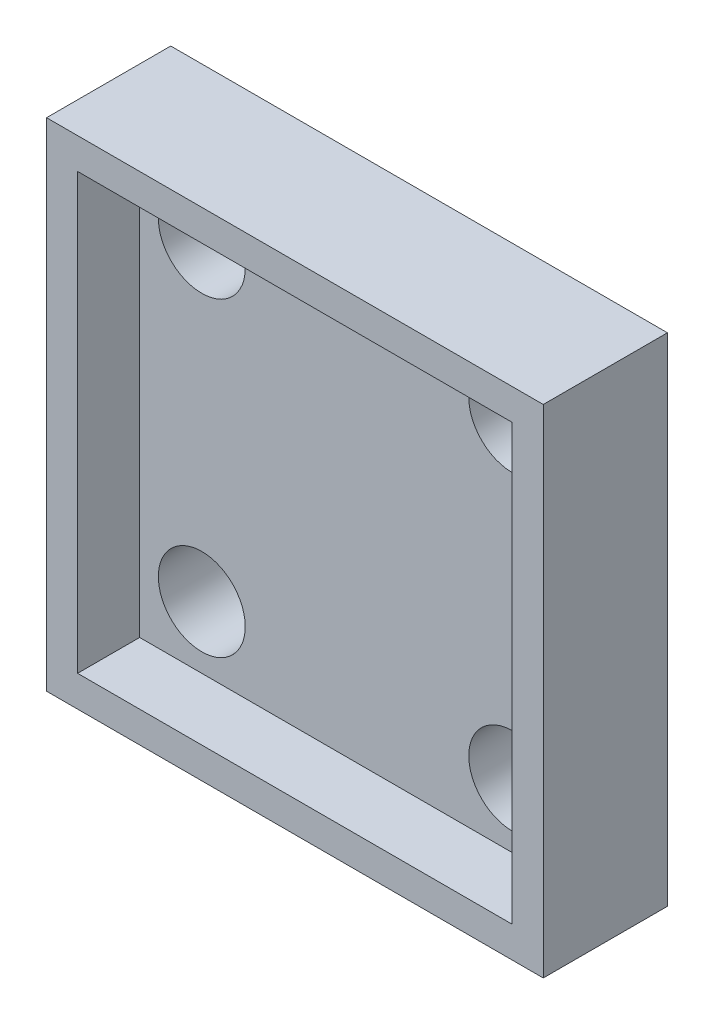
ISO-10303-21;
HEADER;
FILE_DESCRIPTION(('STEP AP214'),'2;1');
FILE_NAME('part.step','',(''),(''),'','','');
FILE_SCHEMA(('AUTOMOTIVE_DESIGN { 1 0 10303 214 1 1 1 1 }'));
ENDSEC;
DATA;
#1=APPLICATION_CONTEXT('core data for automotive mechanical design processes');
#2=APPLICATION_PROTOCOL_DEFINITION('international standard','automotive_design',2000,#1);
#3=PRODUCT_CONTEXT('',#1,'mechanical');
#4=PRODUCT('Part','Part','',(#3));
#5=PRODUCT_RELATED_PRODUCT_CATEGORY('part','',(#4));
#6=PRODUCT_DEFINITION_FORMATION('','',#4);
#7=PRODUCT_DEFINITION_CONTEXT('part definition',#1,'design');
#8=PRODUCT_DEFINITION('design','',#6,#7);
#9=PRODUCT_DEFINITION_SHAPE('','',#8);
#10=(LENGTH_UNIT() NAMED_UNIT(*) SI_UNIT(.MILLI.,.METRE.));
#11=(NAMED_UNIT(*) PLANE_ANGLE_UNIT() SI_UNIT($,.RADIAN.));
#12=(NAMED_UNIT(*) SI_UNIT($,.STERADIAN.) SOLID_ANGLE_UNIT());
#13=UNCERTAINTY_MEASURE_WITH_UNIT(LENGTH_MEASURE(1.E-05),#10,'distance_accuracy_value','');
#14=(GEOMETRIC_REPRESENTATION_CONTEXT(3) GLOBAL_UNCERTAINTY_ASSIGNED_CONTEXT((#13)) GLOBAL_UNIT_ASSIGNED_CONTEXT((#10,
#11,#12)) REPRESENTATION_CONTEXT('',''));
#15=CARTESIAN_POINT('',(0.,0.,0.));
#16=DIRECTION('',(0.,0.,1.));
#17=DIRECTION('',(1.,0.,0.));
#18=AXIS2_PLACEMENT_3D('',#15,#16,#17);
#19=CARTESIAN_POINT('',(-20.,-20.,5.00000000000004));
#20=DIRECTION('',(1.,0.,0.));
#21=DIRECTION('',(0.,0.,-1.));
#22=AXIS2_PLACEMENT_3D('',#19,#20,#21);
#23=PLANE('',#22);
#24=DIRECTION('',(0.,-1.,0.));
#25=VECTOR('',#24,1.);
#26=CARTESIAN_POINT('',(-20.,-20.,0.));
#27=LINE('',#26,#25);
#28=CARTESIAN_POINT('',(-20.,20.,0.));
#29=VERTEX_POINT('',#28);
#30=CARTESIAN_POINT('',(-20.,-20.,0.));
#31=VERTEX_POINT('',#30);
#32=EDGE_CURVE('E169',#29,#31,#27,.T.);
#33=ORIENTED_EDGE('',*,*,#32,.T.);
#34=DIRECTION('',(0.,0.,-1.));
#35=VECTOR('',#34,1.);
#36=CARTESIAN_POINT('',(-20.,-20.,5.00000000000004));
#37=LINE('',#36,#35);
#38=CARTESIAN_POINT('',(-20.,-20.,10.0000000000001));
#39=VERTEX_POINT('',#38);
#40=EDGE_CURVE('E11',#39,#31,#37,.T.);
#41=ORIENTED_EDGE('',*,*,#40,.F.);
#42=DIRECTION('',(0.,-1.,0.));
#43=VECTOR('',#42,1.);
#44=CARTESIAN_POINT('',(-20.,-20.,10.0000000000001));
#45=LINE('',#44,#43);
#46=CARTESIAN_POINT('',(-20.,20.,10.0000000000001));
#47=VERTEX_POINT('',#46);
#48=EDGE_CURVE('E120',#47,#39,#45,.T.);
#49=ORIENTED_EDGE('',*,*,#48,.F.);
#50=DIRECTION('',(0.,0.,-1.));
#51=VECTOR('',#50,1.);
#52=CARTESIAN_POINT('',(-20.,20.,5.00000000000004));
#53=LINE('',#52,#51);
#54=EDGE_CURVE('E182',#47,#29,#53,.T.);
#55=ORIENTED_EDGE('',*,*,#54,.T.);
#56=EDGE_LOOP('',(#33,#41,#49,#55));
#57=FACE_BOUND('',#56,.T.);
#58=ADVANCED_FACE('F39',(#57),#23,.F.);
#59=CARTESIAN_POINT('',(20.,-20.,5.00000000000004));
#60=DIRECTION('',(0.,1.,0.));
#61=DIRECTION('',(-1.,0.,0.));
#62=AXIS2_PLACEMENT_3D('',#59,#60,#61);
#63=PLANE('',#62);
#64=DIRECTION('',(1.,0.,0.));
#65=VECTOR('',#64,1.);
#66=CARTESIAN_POINT('',(20.,-20.,0.));
#67=LINE('',#66,#65);
#68=CARTESIAN_POINT('',(20.,-20.,0.));
#69=VERTEX_POINT('',#68);
#70=EDGE_CURVE('E173',#31,#69,#67,.T.);
#71=ORIENTED_EDGE('',*,*,#70,.T.);
#72=DIRECTION('',(0.,0.,-1.));
#73=VECTOR('',#72,1.);
#74=CARTESIAN_POINT('',(20.,-20.,5.00000000000004));
#75=LINE('',#74,#73);
#76=CARTESIAN_POINT('',(20.,-20.,10.0000000000001));
#77=VERTEX_POINT('',#76);
#78=EDGE_CURVE('E47',#77,#69,#75,.T.);
#79=ORIENTED_EDGE('',*,*,#78,.F.);
#80=DIRECTION('',(1.,0.,0.));
#81=VECTOR('',#80,1.);
#82=CARTESIAN_POINT('',(20.,-20.,10.0000000000001));
#83=LINE('',#82,#81);
#84=EDGE_CURVE('E157',#39,#77,#83,.T.);
#85=ORIENTED_EDGE('',*,*,#84,.F.);
#86=ORIENTED_EDGE('',*,*,#40,.T.);
#87=EDGE_LOOP('',(#71,#79,#85,#86));
#88=FACE_BOUND('',#87,.T.);
#89=ADVANCED_FACE('F207',(#88),#63,.F.);
#90=CARTESIAN_POINT('',(20.,-20.,5.00000000000004));
#91=DIRECTION('',(-1.,0.,0.));
#92=DIRECTION('',(0.,0.,1.));
#93=AXIS2_PLACEMENT_3D('',#90,#91,#92);
#94=PLANE('',#93);
#95=DIRECTION('',(0.,1.,0.));
#96=VECTOR('',#95,1.);
#97=CARTESIAN_POINT('',(20.,-20.,0.));
#98=LINE('',#97,#96);
#99=CARTESIAN_POINT('',(20.,20.,0.));
#100=VERTEX_POINT('',#99);
#101=EDGE_CURVE('E176',#69,#100,#98,.T.);
#102=ORIENTED_EDGE('',*,*,#101,.T.);
#103=DIRECTION('',(0.,0.,-1.));
#104=VECTOR('',#103,1.);
#105=CARTESIAN_POINT('',(20.,20.,5.00000000000004));
#106=LINE('',#105,#104);
#107=CARTESIAN_POINT('',(20.,20.,10.0000000000001));
#108=VERTEX_POINT('',#107);
#109=EDGE_CURVE('E186',#108,#100,#106,.T.);
#110=ORIENTED_EDGE('',*,*,#109,.F.);
#111=DIRECTION('',(0.,1.,0.));
#112=VECTOR('',#111,1.);
#113=CARTESIAN_POINT('',(20.,-20.,10.0000000000001));
#114=LINE('',#113,#112);
#115=EDGE_CURVE('E161',#77,#108,#114,.T.);
#116=ORIENTED_EDGE('',*,*,#115,.F.);
#117=ORIENTED_EDGE('',*,*,#78,.T.);
#118=EDGE_LOOP('',(#102,#110,#116,#117));
#119=FACE_BOUND('',#118,.T.);
#120=ADVANCED_FACE('F194',(#119),#94,.F.);
#121=CARTESIAN_POINT('',(20.,20.,5.00000000000004));
#122=DIRECTION('',(0.,-1.,0.));
#123=DIRECTION('',(0.,0.,-1.));
#124=AXIS2_PLACEMENT_3D('',#121,#122,#123);
#125=PLANE('',#124);
#126=DIRECTION('',(-1.,0.,0.));
#127=VECTOR('',#126,1.);
#128=CARTESIAN_POINT('',(20.,20.,0.));
#129=LINE('',#128,#127);
#130=EDGE_CURVE('E179',#100,#29,#129,.T.);
#131=ORIENTED_EDGE('',*,*,#130,.T.);
#132=ORIENTED_EDGE('',*,*,#54,.F.);
#133=DIRECTION('',(-1.,0.,0.));
#134=VECTOR('',#133,1.);
#135=CARTESIAN_POINT('',(20.,20.,10.0000000000001));
#136=LINE('',#135,#134);
#137=EDGE_CURVE('E165',#108,#47,#136,.T.);
#138=ORIENTED_EDGE('',*,*,#137,.F.);
#139=ORIENTED_EDGE('',*,*,#109,.T.);
#140=EDGE_LOOP('',(#131,#132,#138,#139));
#141=FACE_BOUND('',#140,.T.);
#142=ADVANCED_FACE('F202',(#141),#125,.F.);
#143=CARTESIAN_POINT('',(0.,0.,0.));
#144=DIRECTION('',(0.,0.,1.));
#145=DIRECTION('',(1.,0.,0.));
#146=AXIS2_PLACEMENT_3D('',#143,#144,#145);
#147=PLANE('',#146);
#148=CARTESIAN_POINT('',(12.5,12.5,0.));
#149=DIRECTION('',(0.,0.,1.));
#150=DIRECTION('',(1.,0.,0.));
#151=AXIS2_PLACEMENT_3D('',#148,#149,#150);
#152=CIRCLE('',#151,3.5);
#153=CARTESIAN_POINT('',(16.,12.5,0.));
#154=VERTEX_POINT('',#153);
#155=EDGE_CURVE('E138',#154,#154,#152,.T.);
#156=ORIENTED_EDGE('',*,*,#155,.T.);
#157=EDGE_LOOP('',(#156));
#158=FACE_BOUND('',#157,.T.);
#159=CARTESIAN_POINT('',(-12.5,-12.5,0.));
#160=DIRECTION('',(0.,0.,1.));
#161=DIRECTION('',(1.,0.,0.));
#162=AXIS2_PLACEMENT_3D('',#159,#160,#161);
#163=CIRCLE('',#162,3.5);
#164=CARTESIAN_POINT('',(-9.,-12.5,0.));
#165=VERTEX_POINT('',#164);
#166=EDGE_CURVE('E264',#165,#165,#163,.T.);
#167=ORIENTED_EDGE('',*,*,#166,.T.);
#168=EDGE_LOOP('',(#167));
#169=FACE_BOUND('',#168,.T.);
#170=CARTESIAN_POINT('',(12.5,-12.5,0.));
#171=DIRECTION('',(0.,0.,1.));
#172=DIRECTION('',(1.,0.,0.));
#173=AXIS2_PLACEMENT_3D('',#170,#171,#172);
#174=CIRCLE('',#173,3.5);
#175=CARTESIAN_POINT('',(16.,-12.5,0.));
#176=VERTEX_POINT('',#175);
#177=EDGE_CURVE('E261',#176,#176,#174,.T.);
#178=ORIENTED_EDGE('',*,*,#177,.T.);
#179=EDGE_LOOP('',(#178));
#180=FACE_BOUND('',#179,.T.);
#181=CARTESIAN_POINT('',(-12.5,12.5,0.));
#182=DIRECTION('',(0.,0.,1.));
#183=DIRECTION('',(1.,0.,0.));
#184=AXIS2_PLACEMENT_3D('',#181,#182,#183);
#185=CIRCLE('',#184,3.5);
#186=CARTESIAN_POINT('',(-9.,12.5,0.));
#187=VERTEX_POINT('',#186);
#188=EDGE_CURVE('E265',#187,#187,#185,.T.);
#189=ORIENTED_EDGE('',*,*,#188,.T.);
#190=EDGE_LOOP('',(#189));
#191=FACE_BOUND('',#190,.T.);
#192=ORIENTED_EDGE('',*,*,#32,.F.);
#193=ORIENTED_EDGE('',*,*,#130,.F.);
#194=ORIENTED_EDGE('',*,*,#101,.F.);
#195=ORIENTED_EDGE('',*,*,#70,.F.);
#196=EDGE_LOOP('',(#192,#193,#194,#195));
#197=FACE_BOUND('',#196,.T.);
#198=ADVANCED_FACE('F200',(#158,#169,#180,#191,#197),#147,.F.);
#199=CARTESIAN_POINT('',(0.,0.,10.0000000000001));
#200=DIRECTION('',(0.,0.,1.));
#201=DIRECTION('',(1.,0.,0.));
#202=AXIS2_PLACEMENT_3D('',#199,#200,#201);
#203=PLANE('',#202);
#204=ORIENTED_EDGE('',*,*,#48,.T.);
#205=ORIENTED_EDGE('',*,*,#84,.T.);
#206=ORIENTED_EDGE('',*,*,#115,.T.);
#207=ORIENTED_EDGE('',*,*,#137,.T.);
#208=EDGE_LOOP('',(#204,#205,#206,#207));
#209=FACE_BOUND('',#208,.T.);
#210=DIRECTION('',(1.,0.,0.));
#211=VECTOR('',#210,1.);
#212=CARTESIAN_POINT('',(17.5019719872786,-17.5019719872786,10.0000000000001));
#213=LINE('',#212,#211);
#214=CARTESIAN_POINT('',(-17.5019719872786,-17.5019719872786,10.0000000000001));
#215=VERTEX_POINT('',#214);
#216=CARTESIAN_POINT('',(17.5019719872786,-17.5019719872786,10.0000000000001));
#217=VERTEX_POINT('',#216);
#218=EDGE_CURVE('E113',#215,#217,#213,.T.);
#219=ORIENTED_EDGE('',*,*,#218,.F.);
#220=DIRECTION('',(0.,-1.,0.));
#221=VECTOR('',#220,1.);
#222=CARTESIAN_POINT('',(-17.5019719872786,-17.5019719872786,10.0000000000001));
#223=LINE('',#222,#221);
#224=CARTESIAN_POINT('',(-17.5019719872786,17.5019719872786,10.0000000000001));
#225=VERTEX_POINT('',#224);
#226=EDGE_CURVE('E103',#225,#215,#223,.T.);
#227=ORIENTED_EDGE('',*,*,#226,.F.);
#228=DIRECTION('',(-1.,0.,0.));
#229=VECTOR('',#228,1.);
#230=CARTESIAN_POINT('',(17.5019719872786,17.5019719872786,10.0000000000001));
#231=LINE('',#230,#229);
#232=CARTESIAN_POINT('',(17.5019719872786,17.5019719872786,10.0000000000001));
#233=VERTEX_POINT('',#232);
#234=EDGE_CURVE('E130',#233,#225,#231,.T.);
#235=ORIENTED_EDGE('',*,*,#234,.F.);
#236=DIRECTION('',(0.,1.,0.));
#237=VECTOR('',#236,1.);
#238=CARTESIAN_POINT('',(17.5019719872786,-17.5019719872786,10.0000000000001));
#239=LINE('',#238,#237);
#240=EDGE_CURVE('E126',#217,#233,#239,.T.);
#241=ORIENTED_EDGE('',*,*,#240,.F.);
#242=EDGE_LOOP('',(#219,#227,#235,#241));
#243=FACE_BOUND('',#242,.T.);
#244=ADVANCED_FACE('F124',(#209,#243),#203,.T.);
#245=CARTESIAN_POINT('',(-17.5019719872786,-17.5019719872786,10.0000000000001));
#246=DIRECTION('',(1.,0.,0.));
#247=DIRECTION('',(0.,0.,-1.));
#248=AXIS2_PLACEMENT_3D('',#245,#246,#247);
#249=PLANE('',#248);
#250=DIRECTION('',(0.,-1.,0.));
#251=VECTOR('',#250,1.);
#252=CARTESIAN_POINT('',(-17.5019719872786,-17.5019719872786,5.00000000000004));
#253=LINE('',#252,#251);
#254=CARTESIAN_POINT('',(-17.5019719872786,17.5019719872786,5.00000000000004));
#255=VERTEX_POINT('',#254);
#256=CARTESIAN_POINT('',(-17.5019719872786,-17.5019719872786,5.00000000000004));
#257=VERTEX_POINT('',#256);
#258=EDGE_CURVE('E54',#255,#257,#253,.T.);
#259=ORIENTED_EDGE('',*,*,#258,.F.);
#260=DIRECTION('',(0.,0.,-1.));
#261=VECTOR('',#260,1.);
#262=CARTESIAN_POINT('',(-17.5019719872786,17.5019719872786,10.0000000000001));
#263=LINE('',#262,#261);
#264=EDGE_CURVE('E108',#225,#255,#263,.T.);
#265=ORIENTED_EDGE('',*,*,#264,.F.);
#266=ORIENTED_EDGE('',*,*,#226,.T.);
#267=DIRECTION('',(0.,0.,-1.));
#268=VECTOR('',#267,1.);
#269=CARTESIAN_POINT('',(-17.5019719872786,-17.5019719872786,10.0000000000001));
#270=LINE('',#269,#268);
#271=EDGE_CURVE('E106',#215,#257,#270,.T.);
#272=ORIENTED_EDGE('',*,*,#271,.T.);
#273=EDGE_LOOP('',(#259,#265,#266,#272));
#274=FACE_BOUND('',#273,.T.);
#275=ADVANCED_FACE('F105',(#274),#249,.T.);
#276=CARTESIAN_POINT('',(17.5019719872786,-17.5019719872786,10.0000000000001));
#277=DIRECTION('',(0.,1.,0.));
#278=DIRECTION('',(0.,0.,1.));
#279=AXIS2_PLACEMENT_3D('',#276,#277,#278);
#280=PLANE('',#279);
#281=DIRECTION('',(1.,0.,0.));
#282=VECTOR('',#281,1.);
#283=CARTESIAN_POINT('',(17.5019719872786,-17.5019719872786,5.00000000000004));
#284=LINE('',#283,#282);
#285=CARTESIAN_POINT('',(17.5019719872786,-17.5019719872786,5.00000000000004));
#286=VERTEX_POINT('',#285);
#287=EDGE_CURVE('E58',#257,#286,#284,.T.);
#288=ORIENTED_EDGE('',*,*,#287,.F.);
#289=ORIENTED_EDGE('',*,*,#271,.F.);
#290=ORIENTED_EDGE('',*,*,#218,.T.);
#291=DIRECTION('',(0.,0.,-1.));
#292=VECTOR('',#291,1.);
#293=CARTESIAN_POINT('',(17.5019719872786,-17.5019719872786,10.0000000000001));
#294=LINE('',#293,#292);
#295=EDGE_CURVE('E121',#217,#286,#294,.T.);
#296=ORIENTED_EDGE('',*,*,#295,.T.);
#297=EDGE_LOOP('',(#288,#289,#290,#296));
#298=FACE_BOUND('',#297,.T.);
#299=ADVANCED_FACE('F117',(#298),#280,.T.);
#300=CARTESIAN_POINT('',(17.5019719872786,-17.5019719872786,10.0000000000001));
#301=DIRECTION('',(-1.,0.,0.));
#302=DIRECTION('',(0.,0.,1.));
#303=AXIS2_PLACEMENT_3D('',#300,#301,#302);
#304=PLANE('',#303);
#305=DIRECTION('',(0.,1.,0.));
#306=VECTOR('',#305,1.);
#307=CARTESIAN_POINT('',(17.5019719872786,-17.5019719872786,5.00000000000004));
#308=LINE('',#307,#306);
#309=CARTESIAN_POINT('',(17.5019719872786,17.5019719872786,5.00000000000004));
#310=VERTEX_POINT('',#309);
#311=EDGE_CURVE('E141',#286,#310,#308,.T.);
#312=ORIENTED_EDGE('',*,*,#311,.F.);
#313=ORIENTED_EDGE('',*,*,#295,.F.);
#314=ORIENTED_EDGE('',*,*,#240,.T.);
#315=DIRECTION('',(0.,0.,-1.));
#316=VECTOR('',#315,1.);
#317=CARTESIAN_POINT('',(17.5019719872786,17.5019719872786,10.0000000000001));
#318=LINE('',#317,#316);
#319=EDGE_CURVE('E148',#233,#310,#318,.T.);
#320=ORIENTED_EDGE('',*,*,#319,.T.);
#321=EDGE_LOOP('',(#312,#313,#314,#320));
#322=FACE_BOUND('',#321,.T.);
#323=ADVANCED_FACE('F232',(#322),#304,.T.);
#324=CARTESIAN_POINT('',(17.5019719872786,17.5019719872786,10.0000000000001));
#325=DIRECTION('',(0.,-1.,0.));
#326=DIRECTION('',(0.,0.,-1.));
#327=AXIS2_PLACEMENT_3D('',#324,#325,#326);
#328=PLANE('',#327);
#329=DIRECTION('',(-1.,0.,0.));
#330=VECTOR('',#329,1.);
#331=CARTESIAN_POINT('',(17.5019719872786,17.5019719872786,5.00000000000004));
#332=LINE('',#331,#330);
#333=EDGE_CURVE('E114',#310,#255,#332,.T.);
#334=ORIENTED_EDGE('',*,*,#333,.F.);
#335=ORIENTED_EDGE('',*,*,#319,.F.);
#336=ORIENTED_EDGE('',*,*,#234,.T.);
#337=ORIENTED_EDGE('',*,*,#264,.T.);
#338=EDGE_LOOP('',(#334,#335,#336,#337));
#339=FACE_BOUND('',#338,.T.);
#340=ADVANCED_FACE('F224',(#339),#328,.T.);
#341=CARTESIAN_POINT('',(0.,0.,5.00000000000004));
#342=DIRECTION('',(0.,0.,1.));
#343=DIRECTION('',(1.,0.,0.));
#344=AXIS2_PLACEMENT_3D('',#341,#342,#343);
#345=PLANE('',#344);
#346=CARTESIAN_POINT('',(12.5,12.5,5.00000000000004));
#347=DIRECTION('',(0.,0.,1.));
#348=DIRECTION('',(1.,0.,0.));
#349=AXIS2_PLACEMENT_3D('',#346,#347,#348);
#350=CIRCLE('',#349,3.5);
#351=CARTESIAN_POINT('',(16.,12.5,5.00000000000004));
#352=VERTEX_POINT('',#351);
#353=EDGE_CURVE('E288',#352,#352,#350,.T.);
#354=ORIENTED_EDGE('',*,*,#353,.F.);
#355=EDGE_LOOP('',(#354));
#356=FACE_BOUND('',#355,.T.);
#357=CARTESIAN_POINT('',(-12.5,-12.5,5.00000000000004));
#358=DIRECTION('',(0.,0.,1.));
#359=DIRECTION('',(1.,0.,0.));
#360=AXIS2_PLACEMENT_3D('',#357,#358,#359);
#361=CIRCLE('',#360,3.5);
#362=CARTESIAN_POINT('',(-9.,-12.5,5.00000000000004));
#363=VERTEX_POINT('',#362);
#364=EDGE_CURVE('E289',#363,#363,#361,.T.);
#365=ORIENTED_EDGE('',*,*,#364,.F.);
#366=EDGE_LOOP('',(#365));
#367=FACE_BOUND('',#366,.T.);
#368=CARTESIAN_POINT('',(12.5,-12.5,5.00000000000004));
#369=DIRECTION('',(0.,0.,1.));
#370=DIRECTION('',(1.,0.,0.));
#371=AXIS2_PLACEMENT_3D('',#368,#369,#370);
#372=CIRCLE('',#371,3.5);
#373=CARTESIAN_POINT('',(16.,-12.5,5.00000000000004));
#374=VERTEX_POINT('',#373);
#375=EDGE_CURVE('E258',#374,#374,#372,.T.);
#376=ORIENTED_EDGE('',*,*,#375,.F.);
#377=EDGE_LOOP('',(#376));
#378=FACE_BOUND('',#377,.T.);
#379=CARTESIAN_POINT('',(-12.5,12.5,5.00000000000004));
#380=DIRECTION('',(0.,0.,1.));
#381=DIRECTION('',(1.,0.,0.));
#382=AXIS2_PLACEMENT_3D('',#379,#380,#381);
#383=CIRCLE('',#382,3.5);
#384=CARTESIAN_POINT('',(-9.,12.5,5.00000000000004));
#385=VERTEX_POINT('',#384);
#386=EDGE_CURVE('E272',#385,#385,#383,.T.);
#387=ORIENTED_EDGE('',*,*,#386,.F.);
#388=EDGE_LOOP('',(#387));
#389=FACE_BOUND('',#388,.T.);
#390=ORIENTED_EDGE('',*,*,#258,.T.);
#391=ORIENTED_EDGE('',*,*,#287,.T.);
#392=ORIENTED_EDGE('',*,*,#311,.T.);
#393=ORIENTED_EDGE('',*,*,#333,.T.);
#394=EDGE_LOOP('',(#390,#391,#392,#393));
#395=FACE_BOUND('',#394,.T.);
#396=ADVANCED_FACE('F220',(#356,#367,#378,#389,#395),#345,.T.);
#397=CARTESIAN_POINT('',(-12.5,12.5,-7.99999999999996));
#398=DIRECTION('',(0.,0.,1.));
#399=DIRECTION('',(1.,0.,0.));
#400=AXIS2_PLACEMENT_3D('',#397,#398,#399);
#401=CYLINDRICAL_SURFACE('',#400,3.5);
#402=ORIENTED_EDGE('',*,*,#386,.T.);
#403=EDGE_LOOP('',(#402));
#404=FACE_BOUND('',#403,.T.);
#405=ORIENTED_EDGE('',*,*,#188,.F.);
#406=EDGE_LOOP('',(#405));
#407=FACE_BOUND('',#406,.T.);
#408=ADVANCED_FACE('F223',(#404,#407),#401,.F.);
#409=CARTESIAN_POINT('',(12.5,-12.5,-7.99999999999996));
#410=DIRECTION('',(0.,0.,1.));
#411=DIRECTION('',(1.,0.,0.));
#412=AXIS2_PLACEMENT_3D('',#409,#410,#411);
#413=CYLINDRICAL_SURFACE('',#412,3.5);
#414=ORIENTED_EDGE('',*,*,#375,.T.);
#415=EDGE_LOOP('',(#414));
#416=FACE_BOUND('',#415,.T.);
#417=ORIENTED_EDGE('',*,*,#177,.F.);
#418=EDGE_LOOP('',(#417));
#419=FACE_BOUND('',#418,.T.);
#420=ADVANCED_FACE('F241',(#416,#419),#413,.F.);
#421=CARTESIAN_POINT('',(-12.5,-12.5,-7.99999999999996));
#422=DIRECTION('',(0.,0.,1.));
#423=DIRECTION('',(1.,0.,0.));
#424=AXIS2_PLACEMENT_3D('',#421,#422,#423);
#425=CYLINDRICAL_SURFACE('',#424,3.5);
#426=ORIENTED_EDGE('',*,*,#364,.T.);
#427=EDGE_LOOP('',(#426));
#428=FACE_BOUND('',#427,.T.);
#429=ORIENTED_EDGE('',*,*,#166,.F.);
#430=EDGE_LOOP('',(#429));
#431=FACE_BOUND('',#430,.T.);
#432=ADVANCED_FACE('F243',(#428,#431),#425,.F.);
#433=CARTESIAN_POINT('',(12.5,12.5,-7.99999999999996));
#434=DIRECTION('',(0.,0.,1.));
#435=DIRECTION('',(1.,0.,0.));
#436=AXIS2_PLACEMENT_3D('',#433,#434,#435);
#437=CYLINDRICAL_SURFACE('',#436,3.5);
#438=ORIENTED_EDGE('',*,*,#353,.T.);
#439=EDGE_LOOP('',(#438));
#440=FACE_BOUND('',#439,.T.);
#441=ORIENTED_EDGE('',*,*,#155,.F.);
#442=EDGE_LOOP('',(#441));
#443=FACE_BOUND('',#442,.T.);
#444=ADVANCED_FACE('F246',(#440,#443),#437,.F.);
#445=CLOSED_SHELL('',(#58,#89,#120,#142,#198,#244,#275,#299,#323,#340,#396,#408,#420,#432,#444));
#446=MANIFOLD_SOLID_BREP('B2',#445);
#447=ADVANCED_BREP_SHAPE_REPRESENTATION('',(#18,#446),#14);
#448=SHAPE_DEFINITION_REPRESENTATION(#9,#447);
ENDSEC;
END-ISO-10303-21;
